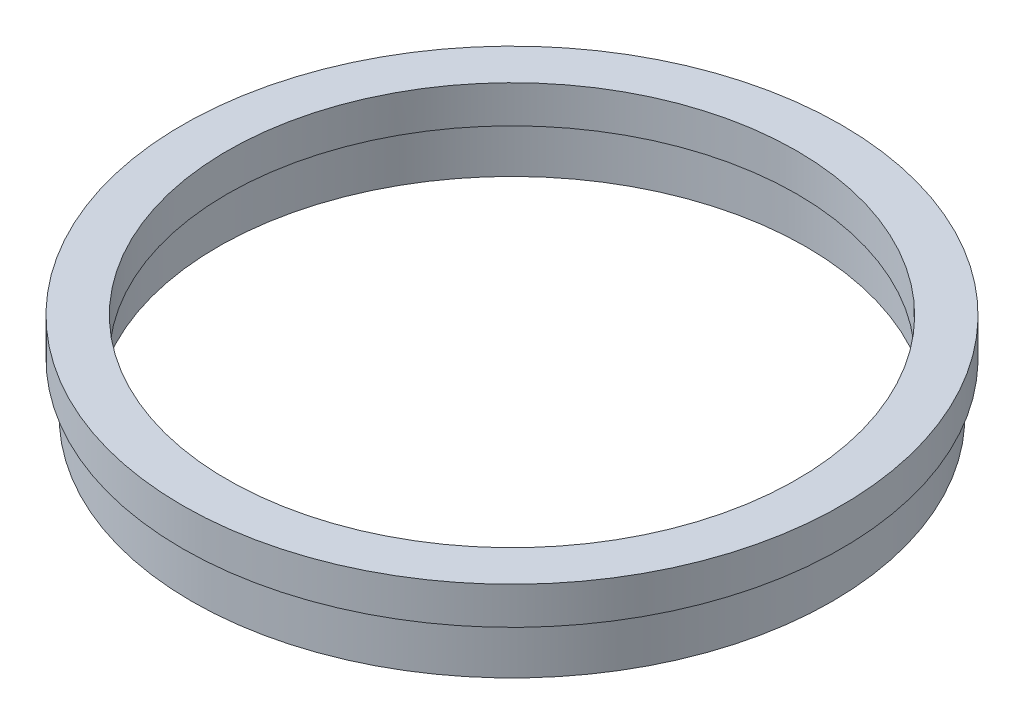
ISO-10303-21;
HEADER;
FILE_DESCRIPTION(('STEP AP214'),'2;1');
FILE_NAME('part.step','',(''),(''),'','','');
FILE_SCHEMA(('AUTOMOTIVE_DESIGN { 1 0 10303 214 1 1 1 1 }'));
ENDSEC;
DATA;
#1=APPLICATION_CONTEXT('core data for automotive mechanical design processes');
#2=APPLICATION_PROTOCOL_DEFINITION('international standard','automotive_design',2000,#1);
#3=PRODUCT_CONTEXT('',#1,'mechanical');
#4=PRODUCT('Part','Part','',(#3));
#5=PRODUCT_RELATED_PRODUCT_CATEGORY('part','',(#4));
#6=PRODUCT_DEFINITION_FORMATION('','',#4);
#7=PRODUCT_DEFINITION_CONTEXT('part definition',#1,'design');
#8=PRODUCT_DEFINITION('design','',#6,#7);
#9=PRODUCT_DEFINITION_SHAPE('','',#8);
#10=(LENGTH_UNIT() NAMED_UNIT(*) SI_UNIT(.MILLI.,.METRE.));
#11=(NAMED_UNIT(*) PLANE_ANGLE_UNIT() SI_UNIT($,.RADIAN.));
#12=(NAMED_UNIT(*) SI_UNIT($,.STERADIAN.) SOLID_ANGLE_UNIT());
#13=UNCERTAINTY_MEASURE_WITH_UNIT(LENGTH_MEASURE(1.E-05),#10,'distance_accuracy_value','');
#14=(GEOMETRIC_REPRESENTATION_CONTEXT(3) GLOBAL_UNCERTAINTY_ASSIGNED_CONTEXT((#13)) GLOBAL_UNIT_ASSIGNED_CONTEXT((#10,
#11,#12)) REPRESENTATION_CONTEXT('',''));
#15=CARTESIAN_POINT('',(0.,0.,0.));
#16=DIRECTION('',(0.,0.,1.));
#17=DIRECTION('',(1.,0.,0.));
#18=AXIS2_PLACEMENT_3D('',#15,#16,#17);
#19=CARTESIAN_POINT('',(0.,5.4,0.));
#20=DIRECTION('',(0.,1.,0.));
#21=DIRECTION('',(0.,0.,1.));
#22=AXIS2_PLACEMENT_3D('',#19,#20,#21);
#23=PLANE('',#22);
#24=CARTESIAN_POINT('',(0.,5.4,0.));
#25=DIRECTION('',(0.,1.,0.));
#26=DIRECTION('',(0.,0.,1.));
#27=AXIS2_PLACEMENT_3D('',#24,#25,#26);
#28=CIRCLE('',#27,34.3);
#29=CARTESIAN_POINT('',(0.,5.39999999999999,-34.3));
#30=VERTEX_POINT('',#29);
#31=EDGE_CURVE('E110',#30,#30,#28,.F.);
#32=ORIENTED_EDGE('',*,*,#31,.F.);
#33=EDGE_LOOP('',(#32));
#34=FACE_BOUND('',#33,.T.);
#35=CARTESIAN_POINT('',(0.,5.4,0.));
#36=DIRECTION('',(0.,1.,0.));
#37=DIRECTION('',(0.,0.,1.));
#38=AXIS2_PLACEMENT_3D('',#35,#36,#37);
#39=CIRCLE('',#38,35.3);
#40=CARTESIAN_POINT('',(0.,5.4,35.3));
#41=VERTEX_POINT('',#40);
#42=EDGE_CURVE('E113',#41,#41,#39,.T.);
#43=ORIENTED_EDGE('',*,*,#42,.F.);
#44=EDGE_LOOP('',(#43));
#45=FACE_BOUND('',#44,.T.);
#46=ADVANCED_FACE('F57',(#34,#45),#23,.F.);
#47=CARTESIAN_POINT('',(0.,0.,0.));
#48=DIRECTION('',(0.,1.,0.));
#49=DIRECTION('',(0.,0.,1.));
#50=AXIS2_PLACEMENT_3D('',#47,#48,#49);
#51=PLANE('',#50);
#52=CARTESIAN_POINT('',(0.,0.,32.9));
#53=DIRECTION('',(0.,-1.,0.));
#54=DIRECTION('',(0.,0.,-1.));
#55=AXIS2_PLACEMENT_3D('',#52,#53,#54);
#56=CIRCLE('',#55,0.5);
#57=CARTESIAN_POINT('',(0.,0.,32.4));
#58=VERTEX_POINT('',#57);
#59=EDGE_CURVE('E65',#58,#58,#56,.T.);
#60=ORIENTED_EDGE('',*,*,#59,.F.);
#61=EDGE_LOOP('',(#60));
#62=FACE_BOUND('',#61,.T.);
#63=CARTESIAN_POINT('',(28.4922357845081,0.,16.4499999999999));
#64=DIRECTION('',(0.,-1.,0.));
#65=DIRECTION('',(-0.86602540378444,0.,-0.499999999999998));
#66=AXIS2_PLACEMENT_3D('',#63,#64,#65);
#67=CIRCLE('',#66,0.5);
#68=CARTESIAN_POINT('',(28.0592230826158,0.,16.1999999999999));
#69=VERTEX_POINT('',#68);
#70=EDGE_CURVE('E72',#69,#69,#67,.T.);
#71=ORIENTED_EDGE('',*,*,#70,.F.);
#72=EDGE_LOOP('',(#71));
#73=FACE_BOUND('',#72,.T.);
#74=CARTESIAN_POINT('',(28.492235784508,0.,-16.4500000000001));
#75=DIRECTION('',(0.,-1.,0.));
#76=DIRECTION('',(-0.866025403784436,0.,0.500000000000004));
#77=AXIS2_PLACEMENT_3D('',#74,#75,#76);
#78=CIRCLE('',#77,0.5);
#79=CARTESIAN_POINT('',(28.0592230826157,0.,-16.2000000000001));
#80=VERTEX_POINT('',#79);
#81=EDGE_CURVE('E97',#80,#80,#78,.T.);
#82=ORIENTED_EDGE('',*,*,#81,.F.);
#83=EDGE_LOOP('',(#82));
#84=FACE_BOUND('',#83,.T.);
#85=CARTESIAN_POINT('',(0.,0.,-32.9));
#86=DIRECTION('',(0.,-1.,0.));
#87=DIRECTION('',(0.,0.,1.));
#88=AXIS2_PLACEMENT_3D('',#85,#86,#87);
#89=CIRCLE('',#88,0.5);
#90=CARTESIAN_POINT('',(0.,0.,-32.4));
#91=VERTEX_POINT('',#90);
#92=EDGE_CURVE('E91',#91,#91,#89,.T.);
#93=ORIENTED_EDGE('',*,*,#92,.F.);
#94=EDGE_LOOP('',(#93));
#95=FACE_BOUND('',#94,.T.);
#96=CARTESIAN_POINT('',(-28.4922357845082,0.,-16.4499999999997));
#97=DIRECTION('',(0.,-1.,0.));
#98=DIRECTION('',(0.866025403784443,0.,0.499999999999992));
#99=AXIS2_PLACEMENT_3D('',#96,#97,#98);
#100=CIRCLE('',#99,0.5);
#101=CARTESIAN_POINT('',(-28.059223082616,0.,-16.1999999999997));
#102=VERTEX_POINT('',#101);
#103=EDGE_CURVE('E85',#102,#102,#100,.T.);
#104=ORIENTED_EDGE('',*,*,#103,.F.);
#105=EDGE_LOOP('',(#104));
#106=FACE_BOUND('',#105,.T.);
#107=CARTESIAN_POINT('',(-28.4922357845078,0.,16.4500000000003));
#108=DIRECTION('',(0.,-1.,0.));
#109=DIRECTION('',(0.866025403784433,0.,-0.50000000000001));
#110=AXIS2_PLACEMENT_3D('',#107,#108,#109);
#111=CIRCLE('',#110,0.5);
#112=CARTESIAN_POINT('',(-28.0592230826156,0.,16.2000000000003));
#113=VERTEX_POINT('',#112);
#114=EDGE_CURVE('E78',#113,#113,#111,.T.);
#115=ORIENTED_EDGE('',*,*,#114,.F.);
#116=EDGE_LOOP('',(#115));
#117=FACE_BOUND('',#116,.T.);
#118=CARTESIAN_POINT('',(0.,0.,0.));
#119=DIRECTION('',(0.,-1.,0.));
#120=DIRECTION('',(0.,0.,-1.));
#121=AXIS2_PLACEMENT_3D('',#118,#119,#120);
#122=CIRCLE('',#121,31.5);
#123=CARTESIAN_POINT('',(0.,0.,-31.5));
#124=VERTEX_POINT('',#123);
#125=EDGE_CURVE('E104',#124,#124,#122,.T.);
#126=ORIENTED_EDGE('',*,*,#125,.F.);
#127=EDGE_LOOP('',(#126));
#128=FACE_BOUND('',#127,.T.);
#129=CARTESIAN_POINT('',(0.,0.,0.));
#130=DIRECTION('',(0.,-1.,0.));
#131=DIRECTION('',(0.,0.,-1.));
#132=AXIS2_PLACEMENT_3D('',#129,#130,#131);
#133=CIRCLE('',#132,34.3);
#134=CARTESIAN_POINT('',(0.,0.,-34.3));
#135=VERTEX_POINT('',#134);
#136=EDGE_CURVE('E107',#135,#135,#133,.T.);
#137=ORIENTED_EDGE('',*,*,#136,.T.);
#138=EDGE_LOOP('',(#137));
#139=FACE_BOUND('',#138,.T.);
#140=ADVANCED_FACE('F59',(#62,#73,#84,#95,#106,#117,#128,#139),#51,.F.);
#141=CARTESIAN_POINT('',(0.,3.,32.9));
#142=DIRECTION('',(0.,-1.,0.));
#143=DIRECTION('',(0.,0.,-1.));
#144=AXIS2_PLACEMENT_3D('',#141,#142,#143);
#145=CYLINDRICAL_SURFACE('',#144,0.5);
#146=CARTESIAN_POINT('',(0.,3.,32.9));
#147=DIRECTION('',(0.,-1.,0.));
#148=DIRECTION('',(0.,0.,-1.));
#149=AXIS2_PLACEMENT_3D('',#146,#147,#148);
#150=CIRCLE('',#149,0.5);
#151=CARTESIAN_POINT('',(0.,3.,32.4));
#152=VERTEX_POINT('',#151);
#153=EDGE_CURVE('E14',#152,#152,#150,.T.);
#154=ORIENTED_EDGE('',*,*,#153,.F.);
#155=EDGE_LOOP('',(#154));
#156=FACE_BOUND('',#155,.T.);
#157=ORIENTED_EDGE('',*,*,#59,.T.);
#158=EDGE_LOOP('',(#157));
#159=FACE_BOUND('',#158,.T.);
#160=ADVANCED_FACE('F149',(#156,#159),#145,.F.);
#161=CARTESIAN_POINT('',(0.,3.,32.9));
#162=DIRECTION('',(0.,-1.,0.));
#163=DIRECTION('',(0.,0.,-1.));
#164=AXIS2_PLACEMENT_3D('',#161,#162,#163);
#165=PLANE('',#164);
#166=ORIENTED_EDGE('',*,*,#153,.T.);
#167=EDGE_LOOP('',(#166));
#168=FACE_BOUND('',#167,.T.);
#169=ADVANCED_FACE('F212',(#168),#165,.T.);
#170=CARTESIAN_POINT('',(28.4922357845081,3.,16.4499999999999));
#171=DIRECTION('',(0.,-1.,0.));
#172=DIRECTION('',(0.,0.,-1.));
#173=AXIS2_PLACEMENT_3D('',#170,#171,#172);
#174=CYLINDRICAL_SURFACE('',#173,0.5);
#175=CARTESIAN_POINT('',(28.4922357845081,3.,16.4499999999999));
#176=DIRECTION('',(0.,-1.,0.));
#177=DIRECTION('',(-0.86602540378444,0.,-0.499999999999998));
#178=AXIS2_PLACEMENT_3D('',#175,#176,#177);
#179=CIRCLE('',#178,0.5);
#180=CARTESIAN_POINT('',(28.0592230826158,3.,16.1999999999999));
#181=VERTEX_POINT('',#180);
#182=EDGE_CURVE('E70',#181,#181,#179,.T.);
#183=ORIENTED_EDGE('',*,*,#182,.F.);
#184=EDGE_LOOP('',(#183));
#185=FACE_BOUND('',#184,.T.);
#186=ORIENTED_EDGE('',*,*,#70,.T.);
#187=EDGE_LOOP('',(#186));
#188=FACE_BOUND('',#187,.T.);
#189=ADVANCED_FACE('F208',(#185,#188),#174,.F.);
#190=CARTESIAN_POINT('',(28.4922357845081,3.,16.4499999999999));
#191=DIRECTION('',(0.,-1.,0.));
#192=DIRECTION('',(-0.86602540378444,0.,-0.499999999999998));
#193=AXIS2_PLACEMENT_3D('',#190,#191,#192);
#194=PLANE('',#193);
#195=ORIENTED_EDGE('',*,*,#182,.T.);
#196=EDGE_LOOP('',(#195));
#197=FACE_BOUND('',#196,.T.);
#198=ADVANCED_FACE('F186',(#197),#194,.T.);
#199=CARTESIAN_POINT('',(28.492235784508,3.,-16.4500000000001));
#200=DIRECTION('',(0.,-1.,0.));
#201=DIRECTION('',(0.,0.,-1.));
#202=AXIS2_PLACEMENT_3D('',#199,#200,#201);
#203=CYLINDRICAL_SURFACE('',#202,0.5);
#204=CARTESIAN_POINT('',(28.492235784508,3.,-16.4500000000001));
#205=DIRECTION('',(0.,-1.,0.));
#206=DIRECTION('',(-0.866025403784436,0.,0.500000000000004));
#207=AXIS2_PLACEMENT_3D('',#204,#205,#206);
#208=CIRCLE('',#207,0.5);
#209=CARTESIAN_POINT('',(28.0592230826157,3.,-16.2000000000001));
#210=VERTEX_POINT('',#209);
#211=EDGE_CURVE('E75',#210,#210,#208,.T.);
#212=ORIENTED_EDGE('',*,*,#211,.F.);
#213=EDGE_LOOP('',(#212));
#214=FACE_BOUND('',#213,.T.);
#215=ORIENTED_EDGE('',*,*,#81,.T.);
#216=EDGE_LOOP('',(#215));
#217=FACE_BOUND('',#216,.T.);
#218=ADVANCED_FACE('F182',(#214,#217),#203,.F.);
#219=CARTESIAN_POINT('',(28.492235784508,3.,-16.4500000000001));
#220=DIRECTION('',(0.,-1.,0.));
#221=DIRECTION('',(-0.866025403784436,0.,0.500000000000004));
#222=AXIS2_PLACEMENT_3D('',#219,#220,#221);
#223=PLANE('',#222);
#224=ORIENTED_EDGE('',*,*,#211,.T.);
#225=EDGE_LOOP('',(#224));
#226=FACE_BOUND('',#225,.T.);
#227=ADVANCED_FACE('F178',(#226),#223,.T.);
#228=CARTESIAN_POINT('',(0.,3.,-32.9));
#229=DIRECTION('',(0.,-1.,0.));
#230=DIRECTION('',(0.,0.,-1.));
#231=AXIS2_PLACEMENT_3D('',#228,#229,#230);
#232=CYLINDRICAL_SURFACE('',#231,0.5);
#233=CARTESIAN_POINT('',(0.,3.,-32.9));
#234=DIRECTION('',(0.,-1.,0.));
#235=DIRECTION('',(0.,0.,1.));
#236=AXIS2_PLACEMENT_3D('',#233,#234,#235);
#237=CIRCLE('',#236,0.5);
#238=CARTESIAN_POINT('',(0.,3.,-32.4));
#239=VERTEX_POINT('',#238);
#240=EDGE_CURVE('E94',#239,#239,#237,.T.);
#241=ORIENTED_EDGE('',*,*,#240,.F.);
#242=EDGE_LOOP('',(#241));
#243=FACE_BOUND('',#242,.T.);
#244=ORIENTED_EDGE('',*,*,#92,.T.);
#245=EDGE_LOOP('',(#244));
#246=FACE_BOUND('',#245,.T.);
#247=ADVANCED_FACE('F181',(#243,#246),#232,.F.);
#248=CARTESIAN_POINT('',(0.,3.,-32.9));
#249=DIRECTION('',(0.,-1.,0.));
#250=DIRECTION('',(0.,0.,1.));
#251=AXIS2_PLACEMENT_3D('',#248,#249,#250);
#252=PLANE('',#251);
#253=ORIENTED_EDGE('',*,*,#240,.T.);
#254=EDGE_LOOP('',(#253));
#255=FACE_BOUND('',#254,.T.);
#256=ADVANCED_FACE('F188',(#255),#252,.T.);
#257=CARTESIAN_POINT('',(-28.4922357845082,3.,-16.4499999999997));
#258=DIRECTION('',(0.,-1.,0.));
#259=DIRECTION('',(0.,0.,-1.));
#260=AXIS2_PLACEMENT_3D('',#257,#258,#259);
#261=CYLINDRICAL_SURFACE('',#260,0.5);
#262=CARTESIAN_POINT('',(-28.4922357845082,3.,-16.4499999999997));
#263=DIRECTION('',(0.,-1.,0.));
#264=DIRECTION('',(0.866025403784443,0.,0.499999999999992));
#265=AXIS2_PLACEMENT_3D('',#262,#263,#264);
#266=CIRCLE('',#265,0.5);
#267=CARTESIAN_POINT('',(-28.059223082616,3.,-16.1999999999997));
#268=VERTEX_POINT('',#267);
#269=EDGE_CURVE('E88',#268,#268,#266,.T.);
#270=ORIENTED_EDGE('',*,*,#269,.F.);
#271=EDGE_LOOP('',(#270));
#272=FACE_BOUND('',#271,.T.);
#273=ORIENTED_EDGE('',*,*,#103,.T.);
#274=EDGE_LOOP('',(#273));
#275=FACE_BOUND('',#274,.T.);
#276=ADVANCED_FACE('F191',(#272,#275),#261,.F.);
#277=CARTESIAN_POINT('',(-28.4922357845082,3.,-16.4499999999997));
#278=DIRECTION('',(0.,-1.,0.));
#279=DIRECTION('',(0.866025403784443,0.,0.499999999999992));
#280=AXIS2_PLACEMENT_3D('',#277,#278,#279);
#281=PLANE('',#280);
#282=ORIENTED_EDGE('',*,*,#269,.T.);
#283=EDGE_LOOP('',(#282));
#284=FACE_BOUND('',#283,.T.);
#285=ADVANCED_FACE('F196',(#284),#281,.T.);
#286=CARTESIAN_POINT('',(-28.4922357845078,3.,16.4500000000003));
#287=DIRECTION('',(0.,-1.,0.));
#288=DIRECTION('',(0.,0.,-1.));
#289=AXIS2_PLACEMENT_3D('',#286,#287,#288);
#290=CYLINDRICAL_SURFACE('',#289,0.5);
#291=CARTESIAN_POINT('',(-28.4922357845078,3.,16.4500000000003));
#292=DIRECTION('',(0.,-1.,0.));
#293=DIRECTION('',(0.866025403784433,0.,-0.50000000000001));
#294=AXIS2_PLACEMENT_3D('',#291,#292,#293);
#295=CIRCLE('',#294,0.5);
#296=CARTESIAN_POINT('',(-28.0592230826156,3.,16.2000000000003));
#297=VERTEX_POINT('',#296);
#298=EDGE_CURVE('E81',#297,#297,#295,.T.);
#299=ORIENTED_EDGE('',*,*,#298,.F.);
#300=EDGE_LOOP('',(#299));
#301=FACE_BOUND('',#300,.T.);
#302=ORIENTED_EDGE('',*,*,#114,.T.);
#303=EDGE_LOOP('',(#302));
#304=FACE_BOUND('',#303,.T.);
#305=ADVANCED_FACE('F174',(#301,#304),#290,.F.);
#306=CARTESIAN_POINT('',(-28.4922357845078,3.,16.4500000000003));
#307=DIRECTION('',(0.,-1.,0.));
#308=DIRECTION('',(0.866025403784433,0.,-0.50000000000001));
#309=AXIS2_PLACEMENT_3D('',#306,#307,#308);
#310=PLANE('',#309);
#311=ORIENTED_EDGE('',*,*,#298,.T.);
#312=EDGE_LOOP('',(#311));
#313=FACE_BOUND('',#312,.T.);
#314=ADVANCED_FACE('F167',(#313),#310,.T.);
#315=CARTESIAN_POINT('',(0.,107.026224247158,0.));
#316=DIRECTION('',(0.,-1.,0.));
#317=DIRECTION('',(0.,0.,-1.));
#318=AXIS2_PLACEMENT_3D('',#315,#316,#317);
#319=CYLINDRICAL_SURFACE('',#318,31.5);
#320=CARTESIAN_POINT('',(0.,5.4,0.));
#321=DIRECTION('',(0.,1.,0.));
#322=DIRECTION('',(0.,0.,1.));
#323=AXIS2_PLACEMENT_3D('',#320,#321,#322);
#324=CIRCLE('',#323,31.5);
#325=CARTESIAN_POINT('',(0.,5.39999999999999,-31.5));
#326=VERTEX_POINT('',#325);
#327=EDGE_CURVE('E82',#326,#326,#324,.F.);
#328=CARTESIAN_POINT('',(0.,0.,-31.5));
#329=CARTESIAN_POINT('',(0.,0.0562499999999984,-31.5));
#330=CARTESIAN_POINT('',(0.,0.112499999999997,-31.5));
#331=CARTESIAN_POINT('',(0.,0.224999999999998,-31.5));
#332=CARTESIAN_POINT('',(0.,0.281250000000001,-31.5));
#333=CARTESIAN_POINT('',(0.,0.393750000000003,-31.5));
#334=CARTESIAN_POINT('',(0.,0.450000000000001,-31.5));
#335=CARTESIAN_POINT('',(0.,0.562499999999998,-31.5));
#336=CARTESIAN_POINT('',(0.,0.618749999999997,-31.5));
#337=CARTESIAN_POINT('',(0.,0.731249999999998,-31.5));
#338=CARTESIAN_POINT('',(0.,0.787500000000001,-31.5));
#339=CARTESIAN_POINT('',(0.,0.900000000000003,-31.5));
#340=CARTESIAN_POINT('',(0.,0.956250000000001,-31.5));
#341=CARTESIAN_POINT('',(0.,1.06875,-31.5));
#342=CARTESIAN_POINT('',(0.,1.125,-31.5));
#343=CARTESIAN_POINT('',(0.,1.23749999999999,-31.5));
#344=CARTESIAN_POINT('',(0.,1.29374999999999,-31.5));
#345=CARTESIAN_POINT('',(0.,1.40624999999999,-31.5));
#346=CARTESIAN_POINT('',(0.,1.4625,-31.5));
#347=CARTESIAN_POINT('',(0.,1.575,-31.5));
#348=CARTESIAN_POINT('',(0.,1.63125,-31.5));
#349=CARTESIAN_POINT('',(0.,1.74374999999999,-31.5));
#350=CARTESIAN_POINT('',(0.,1.79999999999999,-31.5));
#351=CARTESIAN_POINT('',(0.,1.91249999999999,-31.5));
#352=CARTESIAN_POINT('',(0.,1.96875,-31.5));
#353=CARTESIAN_POINT('',(0.,2.08125,-31.5));
#354=CARTESIAN_POINT('',(0.,2.1375,-31.5));
#355=CARTESIAN_POINT('',(0.,2.24999999999999,-31.5));
#356=CARTESIAN_POINT('',(0.,2.30624999999999,-31.5));
#357=CARTESIAN_POINT('',(0.,2.41874999999999,-31.5));
#358=CARTESIAN_POINT('',(0.,2.475,-31.5));
#359=CARTESIAN_POINT('',(0.,2.5875,-31.5));
#360=CARTESIAN_POINT('',(0.,2.64375,-31.5));
#361=CARTESIAN_POINT('',(0.,2.75624999999999,-31.5));
#362=CARTESIAN_POINT('',(0.,2.81249999999999,-31.5));
#363=CARTESIAN_POINT('',(0.,2.92499999999999,-31.5));
#364=CARTESIAN_POINT('',(0.,2.98125,-31.5));
#365=CARTESIAN_POINT('',(0.,3.09375,-31.5));
#366=CARTESIAN_POINT('',(0.,3.15,-31.5));
#367=CARTESIAN_POINT('',(0.,3.26249999999999,-31.5));
#368=CARTESIAN_POINT('',(0.,3.31874999999999,-31.5));
#369=CARTESIAN_POINT('',(0.,3.43124999999999,-31.5));
#370=CARTESIAN_POINT('',(0.,3.4875,-31.5));
#371=CARTESIAN_POINT('',(0.,3.6,-31.5));
#372=CARTESIAN_POINT('',(0.,3.65625,-31.5));
#373=CARTESIAN_POINT('',(0.,3.76874999999999,-31.5));
#374=CARTESIAN_POINT('',(0.,3.82499999999999,-31.5));
#375=CARTESIAN_POINT('',(0.,3.93749999999999,-31.5));
#376=CARTESIAN_POINT('',(0.,3.99374999999999,-31.5));
#377=CARTESIAN_POINT('',(0.,4.10625,-31.5));
#378=CARTESIAN_POINT('',(0.,4.1625,-31.5));
#379=CARTESIAN_POINT('',(0.,4.27499999999999,-31.5));
#380=CARTESIAN_POINT('',(0.,4.33124999999999,-31.5));
#381=CARTESIAN_POINT('',(0.,4.44374999999999,-31.5));
#382=CARTESIAN_POINT('',(0.,4.49999999999999,-31.5));
#383=CARTESIAN_POINT('',(0.,4.61249999999999,-31.5));
#384=CARTESIAN_POINT('',(0.,4.66874999999999,-31.5));
#385=CARTESIAN_POINT('',(0.,4.78124999999999,-31.5));
#386=CARTESIAN_POINT('',(0.,4.83749999999999,-31.5));
#387=CARTESIAN_POINT('',(0.,4.94999999999999,-31.5));
#388=CARTESIAN_POINT('',(0.,5.00624999999999,-31.5));
#389=CARTESIAN_POINT('',(0.,5.11874999999999,-31.5));
#390=CARTESIAN_POINT('',(0.,5.17499999999999,-31.5));
#391=CARTESIAN_POINT('',(0.,5.28749999999999,-31.5));
#392=CARTESIAN_POINT('',(0.,5.34374999999999,-31.5));
#393=CARTESIAN_POINT('',(0.,5.39999999999999,-31.5));
#394=B_SPLINE_CURVE_WITH_KNOTS('',3,(#328,#329,#330,#331,#332,#333,#334,#335,#336,#337,#338,
#339,#340,#341,#342,#343,#344,#345,#346,#347,#348,#349,#350,#351,#352,#353,#354,#355,#356,#357,
#358,#359,#360,#361,#362,#363,#364,#365,#366,#367,#368,#369,#370,#371,#372,#373,#374,#375,#376,
#377,#378,#379,#380,#381,#382,#383,#384,#385,#386,#387,#388,#389,#390,#391,#392,#393),
.UNSPECIFIED.,.F.,.F.,(4,2,2,2,2,2,2,2,2,2,2,2,2,2,2,2,2,2,2,2,2,2,2,2,2,2,2,2,2,2,2,2,4),(0.,
0.168749999999995,0.337500000000004,0.50625,0.674999999999995,0.843750000000004,1.0125,
1.18124999999999,1.34999999999999,1.51875,1.68749999999999,1.85624999999999,2.025,
2.19374999999999,2.36249999999999,2.53125,2.69999999999999,2.86874999999999,3.0375,
3.20624999999999,3.37499999999999,3.54375,3.71249999999999,3.88124999999999,4.05,
4.21874999999999,4.38749999999999,4.55624999999998,4.72499999999999,4.89374999999999,
5.06249999999998,5.23124999999999,5.39999999999999),.UNSPECIFIED.);
#395=EDGE_CURVE('BSEAM158',#124,#326,#394,.T.);
#396=ORIENTED_EDGE('',*,*,#125,.T.);
#397=ORIENTED_EDGE('',*,*,#327,.F.);
#398=ORIENTED_EDGE('',*,*,#395,.T.);
#399=ORIENTED_EDGE('',*,*,#395,.F.);
#400=EDGE_LOOP('',(#396,#398,#397,#399));
#401=FACE_BOUND('',#400,.T.);
#402=ADVANCED_FACE('F158',(#401),#319,.F.);
#403=CARTESIAN_POINT('',(0.,107.026224247158,0.));
#404=DIRECTION('',(0.,-1.,0.));
#405=DIRECTION('',(0.,0.,-1.));
#406=AXIS2_PLACEMENT_3D('',#403,#404,#405);
#407=CYLINDRICAL_SURFACE('',#406,34.3);
#408=CARTESIAN_POINT('',(0.,0.,-34.3));
#409=CARTESIAN_POINT('',(0.,0.0562499999999984,-34.3));
#410=CARTESIAN_POINT('',(0.,0.112499999999997,-34.3));
#411=CARTESIAN_POINT('',(0.,0.224999999999998,-34.3));
#412=CARTESIAN_POINT('',(0.,0.281250000000001,-34.3));
#413=CARTESIAN_POINT('',(0.,0.393750000000003,-34.3));
#414=CARTESIAN_POINT('',(0.,0.450000000000001,-34.3));
#415=CARTESIAN_POINT('',(0.,0.562499999999998,-34.3));
#416=CARTESIAN_POINT('',(0.,0.618749999999997,-34.3));
#417=CARTESIAN_POINT('',(0.,0.731249999999998,-34.3));
#418=CARTESIAN_POINT('',(0.,0.787500000000001,-34.3));
#419=CARTESIAN_POINT('',(0.,0.900000000000003,-34.3));
#420=CARTESIAN_POINT('',(0.,0.956250000000001,-34.3));
#421=CARTESIAN_POINT('',(0.,1.06875,-34.3));
#422=CARTESIAN_POINT('',(0.,1.125,-34.3));
#423=CARTESIAN_POINT('',(0.,1.23749999999999,-34.3));
#424=CARTESIAN_POINT('',(0.,1.29374999999999,-34.3));
#425=CARTESIAN_POINT('',(0.,1.40624999999999,-34.3));
#426=CARTESIAN_POINT('',(0.,1.4625,-34.3));
#427=CARTESIAN_POINT('',(0.,1.575,-34.3));
#428=CARTESIAN_POINT('',(0.,1.63125,-34.3));
#429=CARTESIAN_POINT('',(0.,1.74374999999999,-34.3));
#430=CARTESIAN_POINT('',(0.,1.79999999999999,-34.3));
#431=CARTESIAN_POINT('',(0.,1.91249999999999,-34.3));
#432=CARTESIAN_POINT('',(0.,1.96875,-34.3));
#433=CARTESIAN_POINT('',(0.,2.08125,-34.3));
#434=CARTESIAN_POINT('',(0.,2.1375,-34.3));
#435=CARTESIAN_POINT('',(0.,2.24999999999999,-34.3));
#436=CARTESIAN_POINT('',(0.,2.30624999999999,-34.3));
#437=CARTESIAN_POINT('',(0.,2.41874999999999,-34.3));
#438=CARTESIAN_POINT('',(0.,2.475,-34.3));
#439=CARTESIAN_POINT('',(0.,2.5875,-34.3));
#440=CARTESIAN_POINT('',(0.,2.64375,-34.3));
#441=CARTESIAN_POINT('',(0.,2.75624999999999,-34.3));
#442=CARTESIAN_POINT('',(0.,2.81249999999999,-34.3));
#443=CARTESIAN_POINT('',(0.,2.92499999999999,-34.3));
#444=CARTESIAN_POINT('',(0.,2.98125,-34.3));
#445=CARTESIAN_POINT('',(0.,3.09375,-34.3));
#446=CARTESIAN_POINT('',(0.,3.15,-34.3));
#447=CARTESIAN_POINT('',(0.,3.26249999999999,-34.3));
#448=CARTESIAN_POINT('',(0.,3.31874999999999,-34.3));
#449=CARTESIAN_POINT('',(0.,3.43124999999999,-34.3));
#450=CARTESIAN_POINT('',(0.,3.4875,-34.3));
#451=CARTESIAN_POINT('',(0.,3.6,-34.3));
#452=CARTESIAN_POINT('',(0.,3.65625,-34.3));
#453=CARTESIAN_POINT('',(0.,3.76874999999999,-34.3));
#454=CARTESIAN_POINT('',(0.,3.82499999999999,-34.3));
#455=CARTESIAN_POINT('',(0.,3.93749999999999,-34.3));
#456=CARTESIAN_POINT('',(0.,3.99374999999999,-34.3));
#457=CARTESIAN_POINT('',(0.,4.10625,-34.3));
#458=CARTESIAN_POINT('',(0.,4.1625,-34.3));
#459=CARTESIAN_POINT('',(0.,4.27499999999999,-34.3));
#460=CARTESIAN_POINT('',(0.,4.33124999999999,-34.3));
#461=CARTESIAN_POINT('',(0.,4.44374999999999,-34.3));
#462=CARTESIAN_POINT('',(0.,4.49999999999999,-34.3));
#463=CARTESIAN_POINT('',(0.,4.61249999999999,-34.3));
#464=CARTESIAN_POINT('',(0.,4.66874999999999,-34.3));
#465=CARTESIAN_POINT('',(0.,4.78124999999999,-34.3));
#466=CARTESIAN_POINT('',(0.,4.83749999999999,-34.3));
#467=CARTESIAN_POINT('',(0.,4.94999999999999,-34.3));
#468=CARTESIAN_POINT('',(0.,5.00624999999999,-34.3));
#469=CARTESIAN_POINT('',(0.,5.11874999999999,-34.3));
#470=CARTESIAN_POINT('',(0.,5.17499999999999,-34.3));
#471=CARTESIAN_POINT('',(0.,5.28749999999999,-34.3));
#472=CARTESIAN_POINT('',(0.,5.34374999999999,-34.3));
#473=CARTESIAN_POINT('',(0.,5.39999999999999,-34.3));
#474=B_SPLINE_CURVE_WITH_KNOTS('',3,(#408,#409,#410,#411,#412,#413,#414,#415,#416,#417,#418,
#419,#420,#421,#422,#423,#424,#425,#426,#427,#428,#429,#430,#431,#432,#433,#434,#435,#436,#437,
#438,#439,#440,#441,#442,#443,#444,#445,#446,#447,#448,#449,#450,#451,#452,#453,#454,#455,#456,
#457,#458,#459,#460,#461,#462,#463,#464,#465,#466,#467,#468,#469,#470,#471,#472,#473),
.UNSPECIFIED.,.F.,.F.,(4,2,2,2,2,2,2,2,2,2,2,2,2,2,2,2,2,2,2,2,2,2,2,2,2,2,2,2,2,2,2,2,4),(0.,
0.168749999999995,0.337500000000004,0.50625,0.674999999999995,0.843750000000004,1.0125,
1.18124999999999,1.34999999999999,1.51875,1.68749999999999,1.85624999999999,2.025,
2.19374999999999,2.36249999999999,2.53125,2.69999999999999,2.86874999999999,3.0375,
3.20624999999999,3.37499999999999,3.54375,3.71249999999999,3.88124999999999,4.05,
4.21874999999999,4.38749999999999,4.55624999999998,4.72499999999999,4.89374999999999,
5.06249999999998,5.23124999999999,5.39999999999999),.UNSPECIFIED.);
#475=EDGE_CURVE('BSEAM153',#135,#30,#474,.T.);
#476=ORIENTED_EDGE('',*,*,#136,.F.);
#477=ORIENTED_EDGE('',*,*,#31,.T.);
#478=ORIENTED_EDGE('',*,*,#475,.T.);
#479=ORIENTED_EDGE('',*,*,#475,.F.);
#480=EDGE_LOOP('',(#476,#478,#477,#479));
#481=FACE_BOUND('',#480,.T.);
#482=ADVANCED_FACE('F153',(#481),#407,.T.);
#483=CARTESIAN_POINT('',(0.,5.4,0.));
#484=DIRECTION('',(0.,1.,0.));
#485=DIRECTION('',(0.,0.,1.));
#486=AXIS2_PLACEMENT_3D('',#483,#484,#485);
#487=CIRCLE('',#486,30.5);
#488=CARTESIAN_POINT('',(0.,5.4,30.5));
#489=VERTEX_POINT('',#488);
#490=EDGE_CURVE('E61',#489,#489,#487,.T.);
#491=ORIENTED_EDGE('',*,*,#490,.T.);
#492=EDGE_LOOP('',(#491));
#493=FACE_BOUND('',#492,.T.);
#494=ORIENTED_EDGE('',*,*,#327,.T.);
#495=EDGE_LOOP('',(#494));
#496=FACE_BOUND('',#495,.T.);
#497=ADVANCED_FACE('F138',(#493,#496),#23,.F.);
#498=CARTESIAN_POINT('',(0.,9.4,0.));
#499=DIRECTION('',(0.,-1.,0.));
#500=DIRECTION('',(0.,0.,-1.));
#501=AXIS2_PLACEMENT_3D('',#498,#499,#500);
#502=CYLINDRICAL_SURFACE('',#501,30.5);
#503=CARTESIAN_POINT('',(0.,9.4,0.));
#504=DIRECTION('',(0.,-1.,0.));
#505=DIRECTION('',(0.,0.,-1.));
#506=AXIS2_PLACEMENT_3D('',#503,#504,#505);
#507=CIRCLE('',#506,30.5);
#508=CARTESIAN_POINT('',(0.,9.4,-30.5));
#509=VERTEX_POINT('',#508);
#510=EDGE_CURVE('E116',#509,#509,#507,.T.);
#511=ORIENTED_EDGE('',*,*,#510,.F.);
#512=EDGE_LOOP('',(#511));
#513=FACE_BOUND('',#512,.T.);
#514=ORIENTED_EDGE('',*,*,#490,.F.);
#515=EDGE_LOOP('',(#514));
#516=FACE_BOUND('',#515,.T.);
#517=ADVANCED_FACE('F128',(#513,#516),#502,.F.);
#518=CARTESIAN_POINT('',(0.,9.4,0.));
#519=DIRECTION('',(0.,1.,0.));
#520=DIRECTION('',(0.,0.,1.));
#521=AXIS2_PLACEMENT_3D('',#518,#519,#520);
#522=PLANE('',#521);
#523=ORIENTED_EDGE('',*,*,#510,.T.);
#524=EDGE_LOOP('',(#523));
#525=FACE_BOUND('',#524,.T.);
#526=CARTESIAN_POINT('',(0.,9.4,0.));
#527=DIRECTION('',(0.,-1.,0.));
#528=DIRECTION('',(0.,0.,-1.));
#529=AXIS2_PLACEMENT_3D('',#526,#527,#528);
#530=CIRCLE('',#529,35.3);
#531=CARTESIAN_POINT('',(0.,9.4,-35.3));
#532=VERTEX_POINT('',#531);
#533=EDGE_CURVE('E119',#532,#532,#530,.T.);
#534=ORIENTED_EDGE('',*,*,#533,.F.);
#535=EDGE_LOOP('',(#534));
#536=FACE_BOUND('',#535,.T.);
#537=ADVANCED_FACE('F126',(#525,#536),#522,.T.);
#538=CARTESIAN_POINT('',(0.,9.4,0.));
#539=DIRECTION('',(0.,-1.,0.));
#540=DIRECTION('',(0.,0.,-1.));
#541=AXIS2_PLACEMENT_3D('',#538,#539,#540);
#542=CYLINDRICAL_SURFACE('',#541,35.3);
#543=ORIENTED_EDGE('',*,*,#533,.T.);
#544=EDGE_LOOP('',(#543));
#545=FACE_BOUND('',#544,.T.);
#546=ORIENTED_EDGE('',*,*,#42,.T.);
#547=EDGE_LOOP('',(#546));
#548=FACE_BOUND('',#547,.T.);
#549=ADVANCED_FACE('F123',(#545,#548),#542,.T.);
#550=CLOSED_SHELL('',(#46,#140,#160,#169,#189,#198,#218,#227,#247,#256,#276,#285,#305,#314,#402,
#482,#497,#517,#537,#549));
#551=MANIFOLD_SOLID_BREP('B2',#550);
#552=ADVANCED_BREP_SHAPE_REPRESENTATION('',(#18,#551),#14);
#553=SHAPE_DEFINITION_REPRESENTATION(#9,#552);
ENDSEC;
END-ISO-10303-21;
